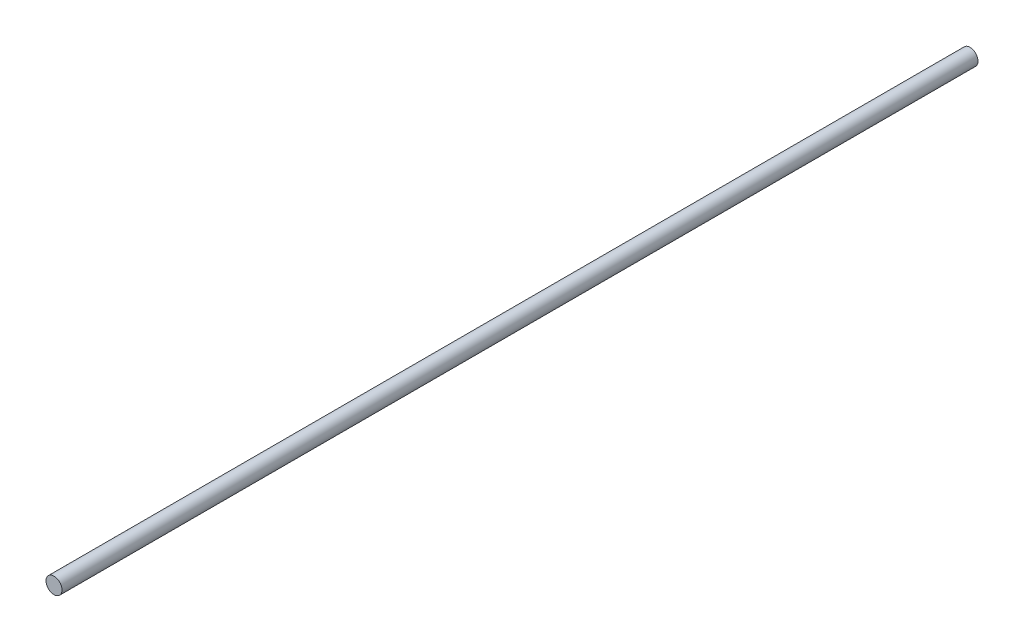
ISO-10303-21;
HEADER;
FILE_DESCRIPTION(('STEP AP214'),'2;1');
FILE_NAME('part.step','',(''),(''),'','','');
FILE_SCHEMA(('AUTOMOTIVE_DESIGN { 1 0 10303 214 1 1 1 1 }'));
ENDSEC;
DATA;
#1=APPLICATION_CONTEXT('core data for automotive mechanical design processes');
#2=APPLICATION_PROTOCOL_DEFINITION('international standard','automotive_design',2000,#1);
#3=PRODUCT_CONTEXT('',#1,'mechanical');
#4=PRODUCT('Part','Part','',(#3));
#5=PRODUCT_RELATED_PRODUCT_CATEGORY('part','',(#4));
#6=PRODUCT_DEFINITION_FORMATION('','',#4);
#7=PRODUCT_DEFINITION_CONTEXT('part definition',#1,'design');
#8=PRODUCT_DEFINITION('design','',#6,#7);
#9=PRODUCT_DEFINITION_SHAPE('','',#8);
#10=(LENGTH_UNIT() NAMED_UNIT(*) SI_UNIT(.MILLI.,.METRE.));
#11=(NAMED_UNIT(*) PLANE_ANGLE_UNIT() SI_UNIT($,.RADIAN.));
#12=(NAMED_UNIT(*) SI_UNIT($,.STERADIAN.) SOLID_ANGLE_UNIT());
#13=UNCERTAINTY_MEASURE_WITH_UNIT(LENGTH_MEASURE(1.E-05),#10,'distance_accuracy_value','');
#14=(GEOMETRIC_REPRESENTATION_CONTEXT(3) GLOBAL_UNCERTAINTY_ASSIGNED_CONTEXT((#13)) GLOBAL_UNIT_ASSIGNED_CONTEXT((#10,
#11,#12)) REPRESENTATION_CONTEXT('',''));
#15=CARTESIAN_POINT('',(0.,0.,0.));
#16=DIRECTION('',(0.,0.,1.));
#17=DIRECTION('',(1.,0.,0.));
#18=AXIS2_PLACEMENT_3D('',#15,#16,#17);
#19=CARTESIAN_POINT('',(0.,0.,457.));
#20=DIRECTION('',(0.,0.,-1.));
#21=DIRECTION('',(-1.,0.,0.));
#22=AXIS2_PLACEMENT_3D('',#19,#20,#21);
#23=CYLINDRICAL_SURFACE('',#22,4.);
#24=CARTESIAN_POINT('',(0.,0.,457.));
#25=DIRECTION('',(0.,0.,1.));
#26=DIRECTION('',(1.,0.,0.));
#27=AXIS2_PLACEMENT_3D('',#24,#25,#26);
#28=CIRCLE('',#27,4.);
#29=CARTESIAN_POINT('',(4.,0.,457.));
#30=VERTEX_POINT('',#29);
#31=EDGE_CURVE('E10',#30,#30,#28,.T.);
#32=ORIENTED_EDGE('',*,*,#31,.F.);
#33=EDGE_LOOP('',(#32));
#34=FACE_BOUND('',#33,.T.);
#35=CARTESIAN_POINT('',(0.,0.,0.));
#36=DIRECTION('',(0.,0.,1.));
#37=DIRECTION('',(1.,0.,0.));
#38=AXIS2_PLACEMENT_3D('',#35,#36,#37);
#39=CIRCLE('',#38,4.);
#40=CARTESIAN_POINT('',(4.,0.,0.));
#41=VERTEX_POINT('',#40);
#42=EDGE_CURVE('E40',#41,#41,#39,.T.);
#43=ORIENTED_EDGE('',*,*,#42,.T.);
#44=EDGE_LOOP('',(#43));
#45=FACE_BOUND('',#44,.T.);
#46=ADVANCED_FACE('F37',(#34,#45),#23,.T.);
#47=CARTESIAN_POINT('',(0.,0.,457.));
#48=DIRECTION('',(0.,0.,1.));
#49=DIRECTION('',(1.,0.,0.));
#50=AXIS2_PLACEMENT_3D('',#47,#48,#49);
#51=PLANE('',#50);
#52=ORIENTED_EDGE('',*,*,#31,.T.);
#53=EDGE_LOOP('',(#52));
#54=FACE_BOUND('',#53,.T.);
#55=ADVANCED_FACE('F52',(#54),#51,.T.);
#56=CARTESIAN_POINT('',(0.,0.,0.));
#57=DIRECTION('',(0.,0.,1.));
#58=DIRECTION('',(1.,0.,0.));
#59=AXIS2_PLACEMENT_3D('',#56,#57,#58);
#60=PLANE('',#59);
#61=ORIENTED_EDGE('',*,*,#42,.F.);
#62=EDGE_LOOP('',(#61));
#63=FACE_BOUND('',#62,.T.);
#64=ADVANCED_FACE('F50',(#63),#60,.F.);
#65=CLOSED_SHELL('',(#46,#55,#64));
#66=MANIFOLD_SOLID_BREP('B2',#65);
#67=ADVANCED_BREP_SHAPE_REPRESENTATION('',(#18,#66),#14);
#68=SHAPE_DEFINITION_REPRESENTATION(#9,#67);
ENDSEC;
END-ISO-10303-21;
